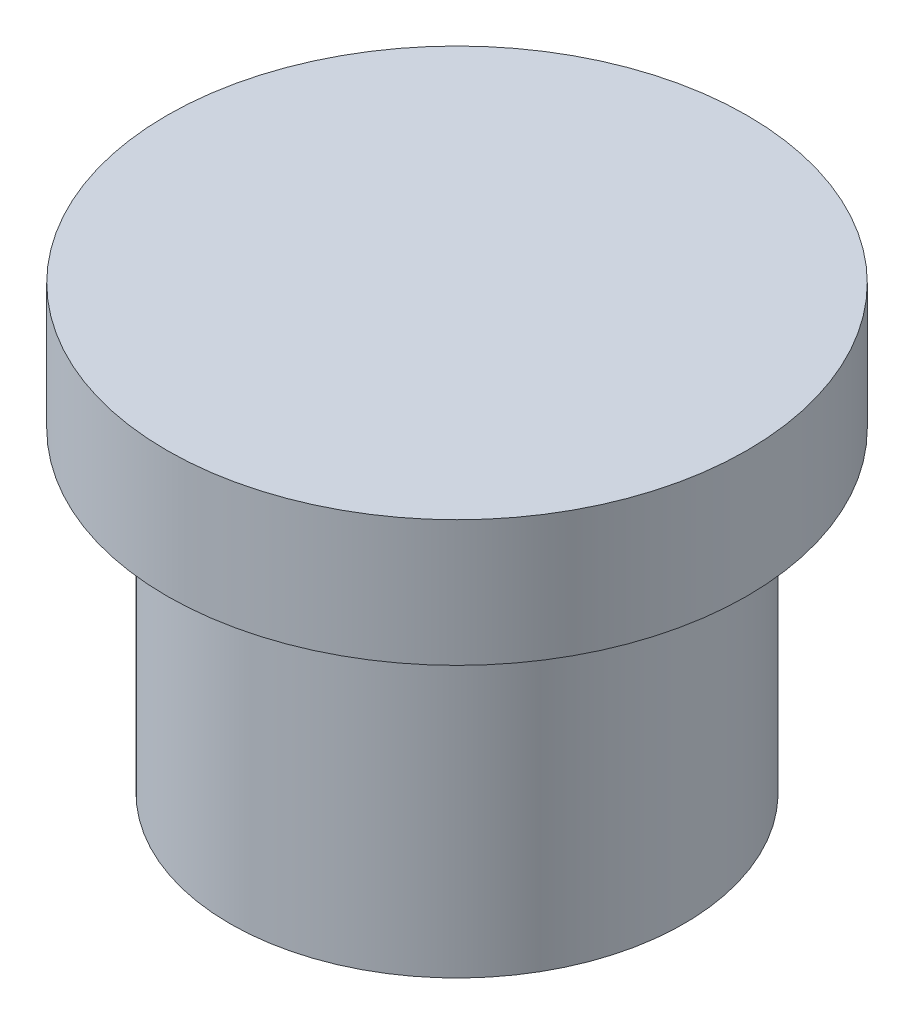
ISO-10303-21;
HEADER;
FILE_DESCRIPTION(('STEP AP214'),'2;1');
FILE_NAME('part.step','',(''),(''),'','','');
FILE_SCHEMA(('AUTOMOTIVE_DESIGN { 1 0 10303 214 1 1 1 1 }'));
ENDSEC;
DATA;
#1=APPLICATION_CONTEXT('core data for automotive mechanical design processes');
#2=APPLICATION_PROTOCOL_DEFINITION('international standard','automotive_design',2000,#1);
#3=PRODUCT_CONTEXT('',#1,'mechanical');
#4=PRODUCT('Part','Part','',(#3));
#5=PRODUCT_RELATED_PRODUCT_CATEGORY('part','',(#4));
#6=PRODUCT_DEFINITION_FORMATION('','',#4);
#7=PRODUCT_DEFINITION_CONTEXT('part definition',#1,'design');
#8=PRODUCT_DEFINITION('design','',#6,#7);
#9=PRODUCT_DEFINITION_SHAPE('','',#8);
#10=(LENGTH_UNIT() NAMED_UNIT(*) SI_UNIT(.MILLI.,.METRE.));
#11=(NAMED_UNIT(*) PLANE_ANGLE_UNIT() SI_UNIT($,.RADIAN.));
#12=(NAMED_UNIT(*) SI_UNIT($,.STERADIAN.) SOLID_ANGLE_UNIT());
#13=UNCERTAINTY_MEASURE_WITH_UNIT(LENGTH_MEASURE(1.E-05),#10,'distance_accuracy_value','');
#14=(GEOMETRIC_REPRESENTATION_CONTEXT(3) GLOBAL_UNCERTAINTY_ASSIGNED_CONTEXT((#13)) GLOBAL_UNIT_ASSIGNED_CONTEXT((#10,
#11,#12)) REPRESENTATION_CONTEXT('',''));
#15=CARTESIAN_POINT('',(0.,0.,0.));
#16=DIRECTION('',(0.,0.,1.));
#17=DIRECTION('',(1.,0.,0.));
#18=AXIS2_PLACEMENT_3D('',#15,#16,#17);
#19=CARTESIAN_POINT('',(0.,35.9679083108094,0.));
#20=DIRECTION('',(0.,-1.,0.));
#21=DIRECTION('',(0.,0.,-1.));
#22=AXIS2_PLACEMENT_3D('',#19,#20,#21);
#23=PLANE('',#22);
#24=CARTESIAN_POINT('',(0.,35.9679083108094,0.));
#25=DIRECTION('',(0.,-1.,0.));
#26=DIRECTION('',(0.,0.,-1.));
#27=AXIS2_PLACEMENT_3D('',#24,#25,#26);
#28=CIRCLE('',#27,8.80829768644588);
#29=CARTESIAN_POINT('',(0.,35.9679083108094,-8.80829768644588));
#30=VERTEX_POINT('',#29);
#31=EDGE_CURVE('E43',#30,#30,#28,.T.);
#32=ORIENTED_EDGE('',*,*,#31,.T.);
#33=EDGE_LOOP('',(#32));
#34=FACE_BOUND('',#33,.T.);
#35=ADVANCED_FACE('F32',(#34),#23,.T.);
#36=CARTESIAN_POINT('',(0.,0.,0.));
#37=DIRECTION('',(0.,-1.,0.));
#38=DIRECTION('',(0.,0.,-1.));
#39=AXIS2_PLACEMENT_3D('',#36,#37,#38);
#40=CYLINDRICAL_SURFACE('',#39,8.80829768644588);
#41=CARTESIAN_POINT('',(0.,25.9679083108094,0.));
#42=DIRECTION('',(0.,-1.,0.));
#43=DIRECTION('',(0.,0.,-1.));
#44=AXIS2_PLACEMENT_3D('',#41,#42,#43);
#45=CIRCLE('',#44,8.80829768644588);
#46=CARTESIAN_POINT('',(8.80829768644588,25.9679083108094,0.));
#47=VERTEX_POINT('',#46);
#48=EDGE_CURVE('E47',#47,#47,#45,.T.);
#49=ORIENTED_EDGE('',*,*,#48,.T.);
#50=EDGE_LOOP('',(#49));
#51=FACE_BOUND('',#50,.T.);
#52=ORIENTED_EDGE('',*,*,#31,.F.);
#53=EDGE_LOOP('',(#52));
#54=FACE_BOUND('',#53,.T.);
#55=ADVANCED_FACE('F85',(#51,#54),#40,.F.);
#56=CARTESIAN_POINT('',(0.,20.5141488857016,0.));
#57=DIRECTION('',(0.,-1.,0.));
#58=DIRECTION('',(1.,0.,0.));
#59=AXIS2_PLACEMENT_3D('',#56,#57,#58);
#60=SPHERICAL_SURFACE('',#59,10.36);
#61=CARTESIAN_POINT('',(0.,15.0603894605938,0.));
#62=DIRECTION('',(0.,-1.,0.));
#63=DIRECTION('',(0.,0.,-1.));
#64=AXIS2_PLACEMENT_3D('',#61,#62,#63);
#65=CIRCLE('',#64,8.80829768644588);
#66=CARTESIAN_POINT('',(8.80829768644588,15.0603894605938,0.));
#67=VERTEX_POINT('',#66);
#68=EDGE_CURVE('E52',#67,#67,#65,.T.);
#69=CARTESIAN_POINT('',(8.80829768644588,15.0603894605938,0.));
#70=CARTESIAN_POINT('',(8.8712882324147,15.1621229957915,0.));
#71=CARTESIAN_POINT('',(8.93251474940412,15.2649486868659,0.));
#72=CARTESIAN_POINT('',(9.05136963215783,15.4726589934592,0.));
#73=CARTESIAN_POINT('',(9.10899799792213,15.5775436089781,0.));
#74=CARTESIAN_POINT('',(9.2205864849593,15.789246377151,0.));
#75=CARTESIAN_POINT('',(9.27454660623217,15.8960645298051,0.));
#76=CARTESIAN_POINT('',(9.37873407198369,16.1115060015305,0.));
#77=CARTESIAN_POINT('',(9.42896141646234,16.2201293206019,0.));
#78=CARTESIAN_POINT('',(9.52562296724513,16.4390507648734,0.));
#79=CARTESIAN_POINT('',(9.57205717354928,16.5493488900735,0.));
#80=CARTESIAN_POINT('',(9.66107672320457,16.7714875282292,0.));
#81=CARTESIAN_POINT('',(9.70366206655572,16.8833280411848,0.));
#82=CARTESIAN_POINT('',(9.78493276366119,17.1084171976466,0.));
#83=CARTESIAN_POINT('',(9.82361811741551,17.2216658411527,0.));
#84=CARTESIAN_POINT('',(9.89704239642532,17.4494353076944,0.));
#85=CARTESIAN_POINT('',(9.93178132168081,17.5639561307299,0.));
#86=CARTESIAN_POINT('',(9.99727104071611,17.794132479025,0.));
#87=CARTESIAN_POINT('',(10.0280218344959,17.9097880042846,0.));
#88=CARTESIAN_POINT('',(10.0854983756178,18.1420949173148,0.));
#89=CARTESIAN_POINT('',(10.1122241229598,18.2587463050853,0.));
#90=CARTESIAN_POINT('',(10.1616184880306,18.4929049079979,0.));
#91=CARTESIAN_POINT('',(10.1842871057593,18.6104121231401,0.));
#92=CARTESIAN_POINT('',(10.2255399988745,18.846141318254,0.));
#93=CARTESIAN_POINT('',(10.244124274261,18.9643632982257,0.));
#94=CARTESIAN_POINT('',(10.2771861730382,19.2013801024157,0.));
#95=CARTESIAN_POINT('',(10.2916637964288,19.3201749266341,0.));
#96=CARTESIAN_POINT('',(10.3164950114283,19.5581948110574,0.));
#97=CARTESIAN_POINT('',(10.3268486030372,19.6774198712625,0.));
#98=CARTESIAN_POINT('',(10.3434193254155,19.9161571029192,0.));
#99=CARTESIAN_POINT('',(10.3496364561851,20.0356692743709,0.));
#100=CARTESIAN_POINT('',(10.3579267934773,20.2748372591156,0.));
#101=CARTESIAN_POINT('',(10.36,20.3944930724086,0.));
#102=CARTESIAN_POINT('',(10.36,20.6338046989946,0.));
#103=CARTESIAN_POINT('',(10.3579267934773,20.7534605122877,0.));
#104=CARTESIAN_POINT('',(10.3496364561851,20.9926284970324,0.));
#105=CARTESIAN_POINT('',(10.3434193254155,21.112140668484,0.));
#106=CARTESIAN_POINT('',(10.3268486030371,21.3508779001408,0.));
#107=CARTESIAN_POINT('',(10.3164950114283,21.4701029603458,0.));
#108=CARTESIAN_POINT('',(10.2916637964288,21.7081228447692,0.));
#109=CARTESIAN_POINT('',(10.2771861730382,21.8269176689875,0.));
#110=CARTESIAN_POINT('',(10.244124274261,22.0639344731776,0.));
#111=CARTESIAN_POINT('',(10.2255399988745,22.1821564531493,0.));
#112=CARTESIAN_POINT('',(10.1842871057593,22.4178856482631,0.));
#113=CARTESIAN_POINT('',(10.1616184880306,22.5353928634053,0.));
#114=CARTESIAN_POINT('',(10.1122241229598,22.769551466318,0.));
#115=CARTESIAN_POINT('',(10.0854983756178,22.8862028540885,0.));
#116=CARTESIAN_POINT('',(10.0280218344959,23.1185097671186,0.));
#117=CARTESIAN_POINT('',(9.99727104071611,23.2341652923783,0.));
#118=CARTESIAN_POINT('',(9.93178132168081,23.4643416406734,0.));
#119=CARTESIAN_POINT('',(9.89704239642532,23.5788624637089,0.));
#120=CARTESIAN_POINT('',(9.82361811741551,23.8066319302505,0.));
#121=CARTESIAN_POINT('',(9.78493276366119,23.9198805737566,0.));
#122=CARTESIAN_POINT('',(9.70366206655572,24.1449697302184,0.));
#123=CARTESIAN_POINT('',(9.66107672320457,24.256810243174,0.));
#124=CARTESIAN_POINT('',(9.57205717354927,24.4789488813297,0.));
#125=CARTESIAN_POINT('',(9.52562296724513,24.5892470065299,0.));
#126=CARTESIAN_POINT('',(9.42896141646234,24.8081684508014,0.));
#127=CARTESIAN_POINT('',(9.37873407198369,24.9167917698727,0.));
#128=CARTESIAN_POINT('',(9.27454660623217,25.1322332415982,0.));
#129=CARTESIAN_POINT('',(9.2205864849593,25.2390513942522,0.));
#130=CARTESIAN_POINT('',(9.10899799792213,25.4507541624251,0.));
#131=CARTESIAN_POINT('',(9.05136963215783,25.555638777944,0.));
#132=CARTESIAN_POINT('',(8.93251474940412,25.7633490845373,0.));
#133=CARTESIAN_POINT('',(8.8712882324147,25.8661747756118,0.));
#134=CARTESIAN_POINT('',(8.80829768644588,25.9679083108094,0.));
#135=B_SPLINE_CURVE_WITH_KNOTS('',3,(#69,#70,#71,#72,#73,#74,#75,#76,#77,#78,#79,#80,#81,#82,
#83,#84,#85,#86,#87,#88,#89,#90,#91,#92,#93,#94,#95,#96,#97,#98,#99,#100,#101,#102,#103,#104,
#105,#106,#107,#108,#109,#110,#111,#112,#113,#114,#115,#116,#117,#118,#119,#120,#121,#122,#123,
#124,#125,#126,#127,#128,#129,#130,#131,#132,#133,#134),.UNSPECIFIED.,.F.,.F.,(4,2,2,2,2,2,2,2,
2,2,2,2,2,2,2,2,2,2,2,2,2,2,2,2,2,2,2,2,2,2,2,2,4),(0.,0.358949485996662,0.717898971993322,
1.07684845798998,1.43579794398665,1.79474742998331,2.15369691597997,2.51264640197664,
2.87159588797329,3.23054537396996,3.58949485996662,3.94844434596328,4.30739383195994,
4.6663433179566,5.02529280395327,5.38424228994993,5.74319177594659,6.10214126194325,
6.46109074793991,6.82004023393657,7.17898971993324,7.5379392059299,7.89688869192656,
8.25583817792322,8.61478766391989,8.97373714991655,9.33268663591321,9.69163612190987,
10.0505856079065,10.4095350939032,10.7684845798999,11.1274340658965,11.4863835518932),.UNSPECIFIED.);
#136=EDGE_CURVE('BSEAM79',#67,#47,#135,.T.);
#137=ORIENTED_EDGE('',*,*,#68,.T.);
#138=ORIENTED_EDGE('',*,*,#48,.F.);
#139=ORIENTED_EDGE('',*,*,#136,.T.);
#140=ORIENTED_EDGE('',*,*,#136,.F.);
#141=EDGE_LOOP('',(#137,#139,#138,#140));
#142=FACE_BOUND('',#141,.T.);
#143=ADVANCED_FACE('F79',(#142),#60,.F.);
#144=CARTESIAN_POINT('',(0.,15.0603894605938,0.));
#145=DIRECTION('',(0.,1.,0.));
#146=DIRECTION('',(0.,0.,1.));
#147=AXIS2_PLACEMENT_3D('',#144,#145,#146);
#148=CONICAL_SURFACE('',#147,8.80829768644588,0.385431449092071);
#149=CARTESIAN_POINT('',(0.,13.6704349929408,0.));
#150=DIRECTION('',(0.,-1.,0.));
#151=DIRECTION('',(0.,0.,-1.));
#152=AXIS2_PLACEMENT_3D('',#149,#150,#151);
#153=CIRCLE('',#152,8.24435923426205);
#154=CARTESIAN_POINT('',(0.,13.6704349929408,-8.24435923426205));
#155=VERTEX_POINT('',#154);
#156=EDGE_CURVE('E55',#155,#155,#153,.T.);
#157=ORIENTED_EDGE('',*,*,#156,.T.);
#158=EDGE_LOOP('',(#157));
#159=FACE_BOUND('',#158,.T.);
#160=ORIENTED_EDGE('',*,*,#68,.F.);
#161=EDGE_LOOP('',(#160));
#162=FACE_BOUND('',#161,.T.);
#163=ADVANCED_FACE('F73',(#159,#162),#148,.F.);
#164=CARTESIAN_POINT('',(0.,13.6704349929408,0.));
#165=DIRECTION('',(0.,-1.,0.));
#166=DIRECTION('',(0.,0.,-1.));
#167=AXIS2_PLACEMENT_3D('',#164,#165,#166);
#168=CONICAL_SURFACE('',#167,8.24435923426205,0.399966714305381);
#169=CARTESIAN_POINT('',(0.,10.,0.));
#170=DIRECTION('',(0.,1.,0.));
#171=DIRECTION('',(0.,0.,1.));
#172=AXIS2_PLACEMENT_3D('',#169,#170,#171);
#173=CIRCLE('',#172,9.79605024922349);
#174=CARTESIAN_POINT('',(0.,9.99999999999999,9.79605024922349));
#175=VERTEX_POINT('',#174);
#176=EDGE_CURVE('E64',#175,#175,#173,.T.);
#177=ORIENTED_EDGE('',*,*,#176,.F.);
#178=EDGE_LOOP('',(#177));
#179=FACE_BOUND('',#178,.T.);
#180=ORIENTED_EDGE('',*,*,#156,.F.);
#181=EDGE_LOOP('',(#180));
#182=FACE_BOUND('',#181,.T.);
#183=ADVANCED_FACE('F70',(#179,#182),#168,.F.);
#184=CARTESIAN_POINT('',(-23.,10.,-18.));
#185=DIRECTION('',(0.,1.,0.));
#186=DIRECTION('',(0.,0.,1.));
#187=AXIS2_PLACEMENT_3D('',#184,#185,#186);
#188=PLANE('',#187);
#189=ORIENTED_EDGE('',*,*,#176,.T.);
#190=EDGE_LOOP('',(#189));
#191=FACE_BOUND('',#190,.T.);
#192=CARTESIAN_POINT('',(0.,10.,0.));
#193=DIRECTION('',(0.,1.,0.));
#194=DIRECTION('',(0.,0.,1.));
#195=AXIS2_PLACEMENT_3D('',#192,#193,#194);
#196=CIRCLE('',#195,18.);
#197=CARTESIAN_POINT('',(0.,9.99999999999999,18.));
#198=VERTEX_POINT('',#197);
#199=EDGE_CURVE('E10',#198,#198,#196,.F.);
#200=ORIENTED_EDGE('',*,*,#199,.T.);
#201=EDGE_LOOP('',(#200));
#202=FACE_BOUND('',#201,.T.);
#203=ADVANCED_FACE('F68',(#191,#202),#188,.F.);
#204=CARTESIAN_POINT('',(0.,45.,0.));
#205=DIRECTION('',(0.,1.,0.));
#206=DIRECTION('',(0.,0.,1.));
#207=AXIS2_PLACEMENT_3D('',#204,#205,#206);
#208=PLANE('',#207);
#209=CARTESIAN_POINT('',(0.,45.,0.));
#210=DIRECTION('',(0.,-1.,0.));
#211=DIRECTION('',(0.,0.,-1.));
#212=AXIS2_PLACEMENT_3D('',#209,#210,#211);
#213=CIRCLE('',#212,23.);
#214=CARTESIAN_POINT('',(0.,45.,-23.));
#215=VERTEX_POINT('',#214);
#216=EDGE_CURVE('E39',#215,#215,#213,.T.);
#217=ORIENTED_EDGE('',*,*,#216,.F.);
#218=EDGE_LOOP('',(#217));
#219=FACE_BOUND('',#218,.T.);
#220=ADVANCED_FACE('F98',(#219),#208,.T.);
#221=CARTESIAN_POINT('',(0.,0.,0.));
#222=DIRECTION('',(0.,-1.,0.));
#223=DIRECTION('',(0.,0.,-1.));
#224=AXIS2_PLACEMENT_3D('',#221,#222,#223);
#225=CYLINDRICAL_SURFACE('',#224,23.);
#226=ORIENTED_EDGE('',*,*,#216,.T.);
#227=EDGE_LOOP('',(#226));
#228=FACE_BOUND('',#227,.T.);
#229=CARTESIAN_POINT('',(0.,35.,0.));
#230=DIRECTION('',(0.,-1.,0.));
#231=DIRECTION('',(0.,0.,-1.));
#232=AXIS2_PLACEMENT_3D('',#229,#230,#231);
#233=CIRCLE('',#232,23.);
#234=CARTESIAN_POINT('',(0.,35.,-23.));
#235=VERTEX_POINT('',#234);
#236=EDGE_CURVE('E61',#235,#235,#233,.T.);
#237=ORIENTED_EDGE('',*,*,#236,.F.);
#238=EDGE_LOOP('',(#237));
#239=FACE_BOUND('',#238,.T.);
#240=ADVANCED_FACE('F34',(#228,#239),#225,.T.);
#241=CARTESIAN_POINT('',(18.,35.,0.));
#242=DIRECTION('',(0.,-1.,0.));
#243=DIRECTION('',(0.,0.,-1.));
#244=AXIS2_PLACEMENT_3D('',#241,#242,#243);
#245=PLANE('',#244);
#246=ORIENTED_EDGE('',*,*,#236,.T.);
#247=EDGE_LOOP('',(#246));
#248=FACE_BOUND('',#247,.T.);
#249=CARTESIAN_POINT('',(0.,35.,0.));
#250=DIRECTION('',(0.,-1.,0.));
#251=DIRECTION('',(0.,0.,-1.));
#252=AXIS2_PLACEMENT_3D('',#249,#250,#251);
#253=CIRCLE('',#252,18.);
#254=CARTESIAN_POINT('',(0.,35.,-18.));
#255=VERTEX_POINT('',#254);
#256=EDGE_CURVE('E58',#255,#255,#253,.T.);
#257=ORIENTED_EDGE('',*,*,#256,.F.);
#258=EDGE_LOOP('',(#257));
#259=FACE_BOUND('',#258,.T.);
#260=ADVANCED_FACE('F105',(#248,#259),#245,.T.);
#261=CARTESIAN_POINT('',(0.,0.,0.));
#262=DIRECTION('',(0.,-1.,0.));
#263=DIRECTION('',(0.,0.,-1.));
#264=AXIS2_PLACEMENT_3D('',#261,#262,#263);
#265=CYLINDRICAL_SURFACE('',#264,18.);
#266=ORIENTED_EDGE('',*,*,#199,.F.);
#267=EDGE_LOOP('',(#266));
#268=FACE_BOUND('',#267,.T.);
#269=ORIENTED_EDGE('',*,*,#256,.T.);
#270=EDGE_LOOP('',(#269));
#271=FACE_BOUND('',#270,.T.);
#272=ADVANCED_FACE('F112',(#268,#271),#265,.T.);
#273=CLOSED_SHELL('',(#35,#55,#143,#163,#183,#203,#220,#240,#260,#272));
#274=MANIFOLD_SOLID_BREP('B2',#273);
#275=ADVANCED_BREP_SHAPE_REPRESENTATION('',(#18,#274),#14);
#276=SHAPE_DEFINITION_REPRESENTATION(#9,#275);
ENDSEC;
END-ISO-10303-21;
